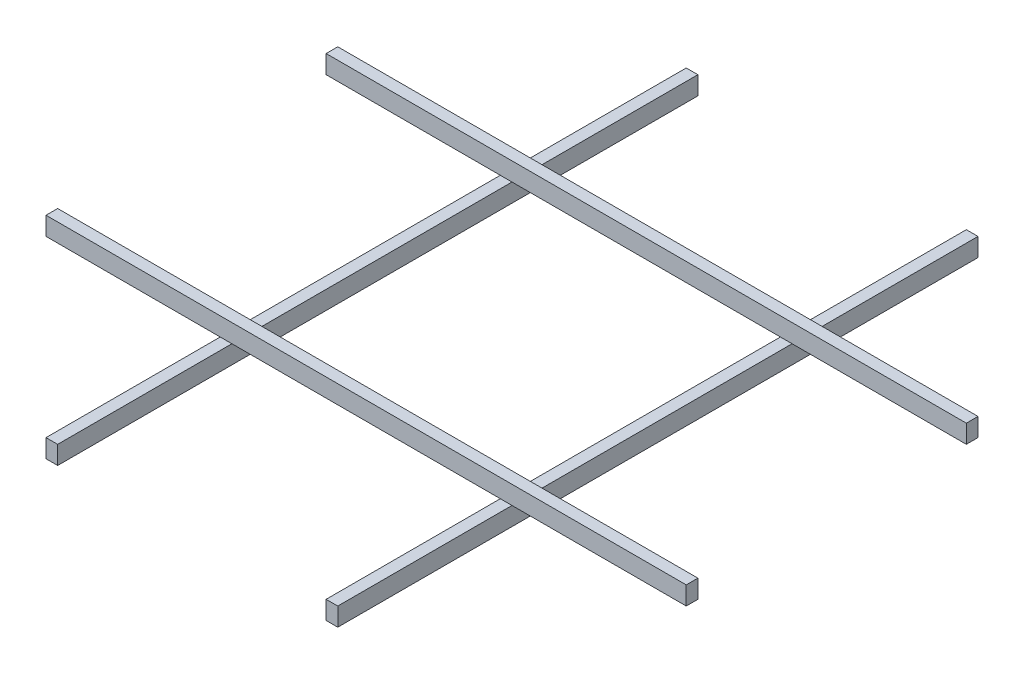
ISO-10303-21;
HEADER;
FILE_DESCRIPTION(('STEP AP214'),'2;1');
FILE_NAME('part.step','',(''),(''),'','','');
FILE_SCHEMA(('AUTOMOTIVE_DESIGN { 1 0 10303 214 1 1 1 1 }'));
ENDSEC;
DATA;
#1=APPLICATION_CONTEXT('core data for automotive mechanical design processes');
#2=APPLICATION_PROTOCOL_DEFINITION('international standard','automotive_design',2000,#1);
#3=PRODUCT_CONTEXT('',#1,'mechanical');
#4=PRODUCT('Part','Part','',(#3));
#5=PRODUCT_RELATED_PRODUCT_CATEGORY('part','',(#4));
#6=PRODUCT_DEFINITION_FORMATION('','',#4);
#7=PRODUCT_DEFINITION_CONTEXT('part definition',#1,'design');
#8=PRODUCT_DEFINITION('design','',#6,#7);
#9=PRODUCT_DEFINITION_SHAPE('','',#8);
#10=(LENGTH_UNIT() NAMED_UNIT(*) SI_UNIT(.MILLI.,.METRE.));
#11=(NAMED_UNIT(*) PLANE_ANGLE_UNIT() SI_UNIT($,.RADIAN.));
#12=(NAMED_UNIT(*) SI_UNIT($,.STERADIAN.) SOLID_ANGLE_UNIT());
#13=UNCERTAINTY_MEASURE_WITH_UNIT(LENGTH_MEASURE(1.E-05),#10,'distance_accuracy_value','');
#14=(GEOMETRIC_REPRESENTATION_CONTEXT(3) GLOBAL_UNCERTAINTY_ASSIGNED_CONTEXT((#13)) GLOBAL_UNIT_ASSIGNED_CONTEXT((#10,
#11,#12)) REPRESENTATION_CONTEXT('',''));
#15=CARTESIAN_POINT('',(0.,0.,0.));
#16=DIRECTION('',(0.,0.,1.));
#17=DIRECTION('',(1.,0.,0.));
#18=AXIS2_PLACEMENT_3D('',#15,#16,#17);
#19=CARTESIAN_POINT('',(4572.,209.55,-1416.05));
#20=DIRECTION('',(0.,0.,1.));
#21=DIRECTION('',(1.,0.,0.));
#22=AXIS2_PLACEMENT_3D('',#19,#20,#21);
#23=PLANE('',#22);
#24=DIRECTION('',(0.,1.,0.));
#25=VECTOR('',#24,1.);
#26=CARTESIAN_POINT('',(-304.8,209.55,-1416.05));
#27=LINE('',#26,#25);
#28=CARTESIAN_POINT('',(-304.8,69.85,-1416.05));
#29=VERTEX_POINT('',#28);
#30=CARTESIAN_POINT('',(-304.8,209.55,-1416.05));
#31=VERTEX_POINT('',#30);
#32=EDGE_CURVE('E134',#29,#31,#27,.T.);
#33=ORIENTED_EDGE('',*,*,#32,.T.);
#34=DIRECTION('',(-1.,0.,0.));
#35=VECTOR('',#34,1.);
#36=CARTESIAN_POINT('',(4572.,209.55,-1416.05));
#37=LINE('',#36,#35);
#38=CARTESIAN_POINT('',(4572.,209.55,-1416.05));
#39=VERTEX_POINT('',#38);
#40=EDGE_CURVE('E13',#39,#31,#37,.T.);
#41=ORIENTED_EDGE('',*,*,#40,.F.);
#42=DIRECTION('',(0.,1.,0.));
#43=VECTOR('',#42,1.);
#44=CARTESIAN_POINT('',(4572.,209.55,-1416.05));
#45=LINE('',#44,#43);
#46=CARTESIAN_POINT('',(4572.,69.85,-1416.05));
#47=VERTEX_POINT('',#46);
#48=EDGE_CURVE('E121',#47,#39,#45,.T.);
#49=ORIENTED_EDGE('',*,*,#48,.F.);
#50=DIRECTION('',(-1.,0.,0.));
#51=VECTOR('',#50,1.);
#52=CARTESIAN_POINT('',(4572.,69.85,-1416.05));
#53=LINE('',#52,#51);
#54=EDGE_CURVE('E130',#47,#29,#53,.T.);
#55=ORIENTED_EDGE('',*,*,#54,.T.);
#56=EDGE_LOOP('',(#33,#41,#49,#55));
#57=FACE_BOUND('',#56,.T.);
#58=ADVANCED_FACE('F69',(#57),#23,.F.);
#59=CARTESIAN_POINT('',(4572.,209.55,-1327.15));
#60=DIRECTION('',(0.,-1.,0.));
#61=DIRECTION('',(0.,0.,-1.));
#62=AXIS2_PLACEMENT_3D('',#59,#60,#61);
#63=PLANE('',#62);
#64=DIRECTION('',(0.,0.,1.));
#65=VECTOR('',#64,1.);
#66=CARTESIAN_POINT('',(-304.8,209.55,-1327.15));
#67=LINE('',#66,#65);
#68=CARTESIAN_POINT('',(-304.8,209.55,-1327.15));
#69=VERTEX_POINT('',#68);
#70=EDGE_CURVE('E125',#31,#69,#67,.T.);
#71=ORIENTED_EDGE('',*,*,#70,.T.);
#72=DIRECTION('',(-1.,0.,0.));
#73=VECTOR('',#72,1.);
#74=CARTESIAN_POINT('',(4572.,209.55,-1327.15));
#75=LINE('',#74,#73);
#76=CARTESIAN_POINT('',(4572.,209.55,-1327.15));
#77=VERTEX_POINT('',#76);
#78=EDGE_CURVE('E78',#77,#69,#75,.T.);
#79=ORIENTED_EDGE('',*,*,#78,.F.);
#80=DIRECTION('',(0.,0.,1.));
#81=VECTOR('',#80,1.);
#82=CARTESIAN_POINT('',(4572.,209.55,-1327.15));
#83=LINE('',#82,#81);
#84=EDGE_CURVE('E116',#39,#77,#83,.T.);
#85=ORIENTED_EDGE('',*,*,#84,.F.);
#86=ORIENTED_EDGE('',*,*,#40,.T.);
#87=EDGE_LOOP('',(#71,#79,#85,#86));
#88=FACE_BOUND('',#87,.T.);
#89=ADVANCED_FACE('F124',(#88),#63,.F.);
#90=CARTESIAN_POINT('',(4572.,209.55,-1327.15));
#91=DIRECTION('',(0.,0.,-1.));
#92=DIRECTION('',(-1.,0.,0.));
#93=AXIS2_PLACEMENT_3D('',#90,#91,#92);
#94=PLANE('',#93);
#95=DIRECTION('',(0.,-1.,0.));
#96=VECTOR('',#95,1.);
#97=CARTESIAN_POINT('',(-304.8,209.55,-1327.15));
#98=LINE('',#97,#96);
#99=CARTESIAN_POINT('',(-304.8,69.85,-1327.15));
#100=VERTEX_POINT('',#99);
#101=EDGE_CURVE('E103',#69,#100,#98,.T.);
#102=ORIENTED_EDGE('',*,*,#101,.T.);
#103=DIRECTION('',(-1.,0.,0.));
#104=VECTOR('',#103,1.);
#105=CARTESIAN_POINT('',(4572.,69.85,-1327.15));
#106=LINE('',#105,#104);
#107=CARTESIAN_POINT('',(4572.,69.85,-1327.15));
#108=VERTEX_POINT('',#107);
#109=EDGE_CURVE('E127',#108,#100,#106,.T.);
#110=ORIENTED_EDGE('',*,*,#109,.F.);
#111=DIRECTION('',(0.,-1.,0.));
#112=VECTOR('',#111,1.);
#113=CARTESIAN_POINT('',(4572.,209.55,-1327.15));
#114=LINE('',#113,#112);
#115=EDGE_CURVE('E119',#77,#108,#114,.T.);
#116=ORIENTED_EDGE('',*,*,#115,.F.);
#117=ORIENTED_EDGE('',*,*,#78,.T.);
#118=EDGE_LOOP('',(#102,#110,#116,#117));
#119=FACE_BOUND('',#118,.T.);
#120=ADVANCED_FACE('F128',(#119),#94,.F.);
#121=CARTESIAN_POINT('',(4572.,69.85,-1327.15));
#122=DIRECTION('',(0.,1.,0.));
#123=DIRECTION('',(0.,0.,1.));
#124=AXIS2_PLACEMENT_3D('',#121,#122,#123);
#125=PLANE('',#124);
#126=DIRECTION('',(0.,0.,-1.));
#127=VECTOR('',#126,1.);
#128=CARTESIAN_POINT('',(-304.8,69.85,-1327.15));
#129=LINE('',#128,#127);
#130=EDGE_CURVE('E109',#100,#29,#129,.T.);
#131=ORIENTED_EDGE('',*,*,#130,.T.);
#132=ORIENTED_EDGE('',*,*,#54,.F.);
#133=DIRECTION('',(0.,0.,-1.));
#134=VECTOR('',#133,1.);
#135=CARTESIAN_POINT('',(4572.,69.85,-1327.15));
#136=LINE('',#135,#134);
#137=EDGE_CURVE('E86',#108,#47,#136,.T.);
#138=ORIENTED_EDGE('',*,*,#137,.F.);
#139=ORIENTED_EDGE('',*,*,#109,.T.);
#140=EDGE_LOOP('',(#131,#132,#138,#139));
#141=FACE_BOUND('',#140,.T.);
#142=ADVANCED_FACE('F143',(#141),#125,.F.);
#143=CARTESIAN_POINT('',(4572.,139.7,-2438.4));
#144=DIRECTION('',(1.,0.,0.));
#145=DIRECTION('',(0.,0.,-1.));
#146=AXIS2_PLACEMENT_3D('',#143,#144,#145);
#147=PLANE('',#146);
#148=ORIENTED_EDGE('',*,*,#48,.T.);
#149=ORIENTED_EDGE('',*,*,#84,.T.);
#150=ORIENTED_EDGE('',*,*,#115,.T.);
#151=ORIENTED_EDGE('',*,*,#137,.T.);
#152=EDGE_LOOP('',(#148,#149,#150,#151));
#153=FACE_BOUND('',#152,.T.);
#154=ADVANCED_FACE('F117',(#153),#147,.T.);
#155=CARTESIAN_POINT('',(-304.8,139.7,-2438.4));
#156=DIRECTION('',(1.,0.,0.));
#157=DIRECTION('',(0.,0.,-1.));
#158=AXIS2_PLACEMENT_3D('',#155,#156,#157);
#159=PLANE('',#158);
#160=ORIENTED_EDGE('',*,*,#32,.F.);
#161=ORIENTED_EDGE('',*,*,#130,.F.);
#162=ORIENTED_EDGE('',*,*,#101,.F.);
#163=ORIENTED_EDGE('',*,*,#70,.F.);
#164=EDGE_LOOP('',(#160,#161,#162,#163));
#165=FACE_BOUND('',#164,.T.);
#166=ADVANCED_FACE('F146',(#165),#159,.F.);
#167=CLOSED_SHELL('',(#58,#89,#120,#142,#154,#166));
#168=MANIFOLD_SOLID_BREP('B2',#167);
#169=CARTESIAN_POINT('',(4572.,209.55,-3549.65));
#170=DIRECTION('',(0.,0.,1.));
#171=DIRECTION('',(1.,0.,0.));
#172=AXIS2_PLACEMENT_3D('',#169,#170,#171);
#173=PLANE('',#172);
#174=DIRECTION('',(0.,1.,0.));
#175=VECTOR('',#174,1.);
#176=CARTESIAN_POINT('',(-304.8,209.55,-3549.65));
#177=LINE('',#176,#175);
#178=CARTESIAN_POINT('',(-304.8,69.85,-3549.65));
#179=VERTEX_POINT('',#178);
#180=CARTESIAN_POINT('',(-304.8,209.55,-3549.65));
#181=VERTEX_POINT('',#180);
#182=EDGE_CURVE('E295',#179,#181,#177,.T.);
#183=ORIENTED_EDGE('',*,*,#182,.T.);
#184=DIRECTION('',(-1.,0.,0.));
#185=VECTOR('',#184,1.);
#186=CARTESIAN_POINT('',(4572.,209.55,-3549.65));
#187=LINE('',#186,#185);
#188=CARTESIAN_POINT('',(4572.,209.55,-3549.65));
#189=VERTEX_POINT('',#188);
#190=EDGE_CURVE('E67',#189,#181,#187,.T.);
#191=ORIENTED_EDGE('',*,*,#190,.F.);
#192=DIRECTION('',(0.,1.,0.));
#193=VECTOR('',#192,1.);
#194=CARTESIAN_POINT('',(4572.,209.55,-3549.65));
#195=LINE('',#194,#193);
#196=CARTESIAN_POINT('',(4572.,69.85,-3549.65));
#197=VERTEX_POINT('',#196);
#198=EDGE_CURVE('E282',#197,#189,#195,.T.);
#199=ORIENTED_EDGE('',*,*,#198,.F.);
#200=DIRECTION('',(-1.,0.,0.));
#201=VECTOR('',#200,1.);
#202=CARTESIAN_POINT('',(4572.,69.85,-3549.65));
#203=LINE('',#202,#201);
#204=EDGE_CURVE('E291',#197,#179,#203,.T.);
#205=ORIENTED_EDGE('',*,*,#204,.T.);
#206=EDGE_LOOP('',(#183,#191,#199,#205));
#207=FACE_BOUND('',#206,.T.);
#208=ADVANCED_FACE('F230',(#207),#173,.F.);
#209=CARTESIAN_POINT('',(4572.,209.55,-3460.75));
#210=DIRECTION('',(0.,-1.,0.));
#211=DIRECTION('',(0.,0.,-1.));
#212=AXIS2_PLACEMENT_3D('',#209,#210,#211);
#213=PLANE('',#212);
#214=DIRECTION('',(0.,0.,1.));
#215=VECTOR('',#214,1.);
#216=CARTESIAN_POINT('',(-304.8,209.55,-3460.75));
#217=LINE('',#216,#215);
#218=CARTESIAN_POINT('',(-304.8,209.55,-3460.75));
#219=VERTEX_POINT('',#218);
#220=EDGE_CURVE('E286',#181,#219,#217,.T.);
#221=ORIENTED_EDGE('',*,*,#220,.T.);
#222=DIRECTION('',(-1.,0.,0.));
#223=VECTOR('',#222,1.);
#224=CARTESIAN_POINT('',(4572.,209.55,-3460.75));
#225=LINE('',#224,#223);
#226=CARTESIAN_POINT('',(4572.,209.55,-3460.75));
#227=VERTEX_POINT('',#226);
#228=EDGE_CURVE('E239',#227,#219,#225,.T.);
#229=ORIENTED_EDGE('',*,*,#228,.F.);
#230=DIRECTION('',(0.,0.,1.));
#231=VECTOR('',#230,1.);
#232=CARTESIAN_POINT('',(4572.,209.55,-3460.75));
#233=LINE('',#232,#231);
#234=EDGE_CURVE('E277',#189,#227,#233,.T.);
#235=ORIENTED_EDGE('',*,*,#234,.F.);
#236=ORIENTED_EDGE('',*,*,#190,.T.);
#237=EDGE_LOOP('',(#221,#229,#235,#236));
#238=FACE_BOUND('',#237,.T.);
#239=ADVANCED_FACE('F285',(#238),#213,.F.);
#240=CARTESIAN_POINT('',(4572.,209.55,-3460.75));
#241=DIRECTION('',(0.,0.,-1.));
#242=DIRECTION('',(-1.,0.,0.));
#243=AXIS2_PLACEMENT_3D('',#240,#241,#242);
#244=PLANE('',#243);
#245=DIRECTION('',(0.,-1.,0.));
#246=VECTOR('',#245,1.);
#247=CARTESIAN_POINT('',(-304.8,209.55,-3460.75));
#248=LINE('',#247,#246);
#249=CARTESIAN_POINT('',(-304.8,69.85,-3460.75));
#250=VERTEX_POINT('',#249);
#251=EDGE_CURVE('E264',#219,#250,#248,.T.);
#252=ORIENTED_EDGE('',*,*,#251,.T.);
#253=DIRECTION('',(-1.,0.,0.));
#254=VECTOR('',#253,1.);
#255=CARTESIAN_POINT('',(4572.,69.85,-3460.75));
#256=LINE('',#255,#254);
#257=CARTESIAN_POINT('',(4572.,69.85,-3460.75));
#258=VERTEX_POINT('',#257);
#259=EDGE_CURVE('E288',#258,#250,#256,.T.);
#260=ORIENTED_EDGE('',*,*,#259,.F.);
#261=DIRECTION('',(0.,-1.,0.));
#262=VECTOR('',#261,1.);
#263=CARTESIAN_POINT('',(4572.,209.55,-3460.75));
#264=LINE('',#263,#262);
#265=EDGE_CURVE('E280',#227,#258,#264,.T.);
#266=ORIENTED_EDGE('',*,*,#265,.F.);
#267=ORIENTED_EDGE('',*,*,#228,.T.);
#268=EDGE_LOOP('',(#252,#260,#266,#267));
#269=FACE_BOUND('',#268,.T.);
#270=ADVANCED_FACE('F289',(#269),#244,.F.);
#271=CARTESIAN_POINT('',(4572.,69.85,-3460.75));
#272=DIRECTION('',(0.,1.,0.));
#273=DIRECTION('',(0.,0.,1.));
#274=AXIS2_PLACEMENT_3D('',#271,#272,#273);
#275=PLANE('',#274);
#276=DIRECTION('',(0.,0.,-1.));
#277=VECTOR('',#276,1.);
#278=CARTESIAN_POINT('',(-304.8,69.85,-3460.75));
#279=LINE('',#278,#277);
#280=EDGE_CURVE('E270',#250,#179,#279,.T.);
#281=ORIENTED_EDGE('',*,*,#280,.T.);
#282=ORIENTED_EDGE('',*,*,#204,.F.);
#283=DIRECTION('',(0.,0.,-1.));
#284=VECTOR('',#283,1.);
#285=CARTESIAN_POINT('',(4572.,69.85,-3460.75));
#286=LINE('',#285,#284);
#287=EDGE_CURVE('E247',#258,#197,#286,.T.);
#288=ORIENTED_EDGE('',*,*,#287,.F.);
#289=ORIENTED_EDGE('',*,*,#259,.T.);
#290=EDGE_LOOP('',(#281,#282,#288,#289));
#291=FACE_BOUND('',#290,.T.);
#292=ADVANCED_FACE('F304',(#291),#275,.F.);
#293=CARTESIAN_POINT('',(4572.,139.7,-4572.));
#294=DIRECTION('',(1.,0.,0.));
#295=DIRECTION('',(0.,0.,-1.));
#296=AXIS2_PLACEMENT_3D('',#293,#294,#295);
#297=PLANE('',#296);
#298=ORIENTED_EDGE('',*,*,#198,.T.);
#299=ORIENTED_EDGE('',*,*,#234,.T.);
#300=ORIENTED_EDGE('',*,*,#265,.T.);
#301=ORIENTED_EDGE('',*,*,#287,.T.);
#302=EDGE_LOOP('',(#298,#299,#300,#301));
#303=FACE_BOUND('',#302,.T.);
#304=ADVANCED_FACE('F278',(#303),#297,.T.);
#305=CARTESIAN_POINT('',(-304.8,139.7,-4572.));
#306=DIRECTION('',(1.,0.,0.));
#307=DIRECTION('',(0.,0.,-1.));
#308=AXIS2_PLACEMENT_3D('',#305,#306,#307);
#309=PLANE('',#308);
#310=ORIENTED_EDGE('',*,*,#182,.F.);
#311=ORIENTED_EDGE('',*,*,#280,.F.);
#312=ORIENTED_EDGE('',*,*,#251,.F.);
#313=ORIENTED_EDGE('',*,*,#220,.F.);
#314=EDGE_LOOP('',(#310,#311,#312,#313));
#315=FACE_BOUND('',#314,.T.);
#316=ADVANCED_FACE('F307',(#315),#309,.F.);
#317=CLOSED_SHELL('',(#208,#239,#270,#292,#304,#316));
#318=MANIFOLD_SOLID_BREP('B7',#317);
#319=CARTESIAN_POINT('',(3155.95,69.85,-4876.8));
#320=DIRECTION('',(1.,0.,0.));
#321=DIRECTION('',(0.,0.,-1.));
#322=AXIS2_PLACEMENT_3D('',#319,#320,#321);
#323=PLANE('',#322);
#324=DIRECTION('',(0.,1.,0.));
#325=VECTOR('',#324,1.);
#326=CARTESIAN_POINT('',(3155.95,69.85,1.95967980799559E-13));
#327=LINE('',#326,#325);
#328=CARTESIAN_POINT('',(3155.95,-69.85,1.95967980799559E-13));
#329=VERTEX_POINT('',#328);
#330=CARTESIAN_POINT('',(3155.95,69.85,1.95967980799559E-13));
#331=VERTEX_POINT('',#330);
#332=EDGE_CURVE('E455',#329,#331,#327,.T.);
#333=ORIENTED_EDGE('',*,*,#332,.T.);
#334=DIRECTION('',(0.,0.,1.));
#335=VECTOR('',#334,1.);
#336=CARTESIAN_POINT('',(3155.95,69.85,-4876.8));
#337=LINE('',#336,#335);
#338=CARTESIAN_POINT('',(3155.95,69.85,-4876.8));
#339=VERTEX_POINT('',#338);
#340=EDGE_CURVE('E228',#339,#331,#337,.T.);
#341=ORIENTED_EDGE('',*,*,#340,.F.);
#342=DIRECTION('',(0.,1.,0.));
#343=VECTOR('',#342,1.);
#344=CARTESIAN_POINT('',(3155.95,69.85,-4876.8));
#345=LINE('',#344,#343);
#346=CARTESIAN_POINT('',(3155.95,-69.85,-4876.8));
#347=VERTEX_POINT('',#346);
#348=EDGE_CURVE('E443',#347,#339,#345,.T.);
#349=ORIENTED_EDGE('',*,*,#348,.F.);
#350=DIRECTION('',(0.,0.,1.));
#351=VECTOR('',#350,1.);
#352=CARTESIAN_POINT('',(3155.95,-69.85,-4876.8));
#353=LINE('',#352,#351);
#354=EDGE_CURVE('E451',#347,#329,#353,.T.);
#355=ORIENTED_EDGE('',*,*,#354,.T.);
#356=EDGE_LOOP('',(#333,#341,#349,#355));
#357=FACE_BOUND('',#356,.T.);
#358=ADVANCED_FACE('F392',(#357),#323,.F.);
#359=CARTESIAN_POINT('',(3244.85,69.85,-4876.8));
#360=DIRECTION('',(0.,-1.,0.));
#361=DIRECTION('',(0.,0.,-1.));
#362=AXIS2_PLACEMENT_3D('',#359,#360,#361);
#363=PLANE('',#362);
#364=DIRECTION('',(1.,0.,0.));
#365=VECTOR('',#364,1.);
#366=CARTESIAN_POINT('',(3244.85,69.85,1.95967980799559E-13));
#367=LINE('',#366,#365);
#368=CARTESIAN_POINT('',(3244.85,69.85,1.95967980799559E-13));
#369=VERTEX_POINT('',#368);
#370=EDGE_CURVE('E447',#331,#369,#367,.T.);
#371=ORIENTED_EDGE('',*,*,#370,.T.);
#372=DIRECTION('',(0.,0.,1.));
#373=VECTOR('',#372,1.);
#374=CARTESIAN_POINT('',(3244.85,69.85,-4876.8));
#375=LINE('',#374,#373);
#376=CARTESIAN_POINT('',(3244.85,69.85,-4876.8));
#377=VERTEX_POINT('',#376);
#378=EDGE_CURVE('E400',#377,#369,#375,.T.);
#379=ORIENTED_EDGE('',*,*,#378,.F.);
#380=DIRECTION('',(1.,0.,0.));
#381=VECTOR('',#380,1.);
#382=CARTESIAN_POINT('',(3244.85,69.85,-4876.8));
#383=LINE('',#382,#381);
#384=EDGE_CURVE('E438',#339,#377,#383,.T.);
#385=ORIENTED_EDGE('',*,*,#384,.F.);
#386=ORIENTED_EDGE('',*,*,#340,.T.);
#387=EDGE_LOOP('',(#371,#379,#385,#386));
#388=FACE_BOUND('',#387,.T.);
#389=ADVANCED_FACE('F446',(#388),#363,.F.);
#390=CARTESIAN_POINT('',(3244.85,69.85,-4876.8));
#391=DIRECTION('',(-1.,0.,0.));
#392=DIRECTION('',(0.,0.,1.));
#393=AXIS2_PLACEMENT_3D('',#390,#391,#392);
#394=PLANE('',#393);
#395=DIRECTION('',(0.,-1.,0.));
#396=VECTOR('',#395,1.);
#397=CARTESIAN_POINT('',(3244.85,69.85,1.95967980799559E-13));
#398=LINE('',#397,#396);
#399=CARTESIAN_POINT('',(3244.85,-69.85,1.95967980799559E-13));
#400=VERTEX_POINT('',#399);
#401=EDGE_CURVE('E425',#369,#400,#398,.T.);
#402=ORIENTED_EDGE('',*,*,#401,.T.);
#403=DIRECTION('',(0.,0.,1.));
#404=VECTOR('',#403,1.);
#405=CARTESIAN_POINT('',(3244.85,-69.85,-4876.8));
#406=LINE('',#405,#404);
#407=CARTESIAN_POINT('',(3244.85,-69.85,-4876.8));
#408=VERTEX_POINT('',#407);
#409=EDGE_CURVE('E448',#408,#400,#406,.T.);
#410=ORIENTED_EDGE('',*,*,#409,.F.);
#411=DIRECTION('',(0.,-1.,0.));
#412=VECTOR('',#411,1.);
#413=CARTESIAN_POINT('',(3244.85,69.85,-4876.8));
#414=LINE('',#413,#412);
#415=EDGE_CURVE('E441',#377,#408,#414,.T.);
#416=ORIENTED_EDGE('',*,*,#415,.F.);
#417=ORIENTED_EDGE('',*,*,#378,.T.);
#418=EDGE_LOOP('',(#402,#410,#416,#417));
#419=FACE_BOUND('',#418,.T.);
#420=ADVANCED_FACE('F449',(#419),#394,.F.);
#421=CARTESIAN_POINT('',(3244.85,-69.85,-4876.8));
#422=DIRECTION('',(0.,1.,0.));
#423=DIRECTION('',(0.,0.,1.));
#424=AXIS2_PLACEMENT_3D('',#421,#422,#423);
#425=PLANE('',#424);
#426=DIRECTION('',(-1.,0.,0.));
#427=VECTOR('',#426,1.);
#428=CARTESIAN_POINT('',(3244.85,-69.85,1.95967980799559E-13));
#429=LINE('',#428,#427);
#430=EDGE_CURVE('E431',#400,#329,#429,.T.);
#431=ORIENTED_EDGE('',*,*,#430,.T.);
#432=ORIENTED_EDGE('',*,*,#354,.F.);
#433=DIRECTION('',(-1.,0.,0.));
#434=VECTOR('',#433,1.);
#435=CARTESIAN_POINT('',(3244.85,-69.85,-4876.8));
#436=LINE('',#435,#434);
#437=EDGE_CURVE('E408',#408,#347,#436,.T.);
#438=ORIENTED_EDGE('',*,*,#437,.F.);
#439=ORIENTED_EDGE('',*,*,#409,.T.);
#440=EDGE_LOOP('',(#431,#432,#438,#439));
#441=FACE_BOUND('',#440,.T.);
#442=ADVANCED_FACE('F462',(#441),#425,.F.);
#443=CARTESIAN_POINT('',(2133.6,0.,-4876.8));
#444=DIRECTION('',(0.,0.,-1.));
#445=DIRECTION('',(-1.,0.,0.));
#446=AXIS2_PLACEMENT_3D('',#443,#444,#445);
#447=PLANE('',#446);
#448=ORIENTED_EDGE('',*,*,#348,.T.);
#449=ORIENTED_EDGE('',*,*,#384,.T.);
#450=ORIENTED_EDGE('',*,*,#415,.T.);
#451=ORIENTED_EDGE('',*,*,#437,.T.);
#452=EDGE_LOOP('',(#448,#449,#450,#451));
#453=FACE_BOUND('',#452,.T.);
#454=ADVANCED_FACE('F439',(#453),#447,.T.);
#455=CARTESIAN_POINT('',(2133.6,0.,1.95967980799559E-13));
#456=DIRECTION('',(0.,0.,-1.));
#457=DIRECTION('',(-1.,0.,0.));
#458=AXIS2_PLACEMENT_3D('',#455,#456,#457);
#459=PLANE('',#458);
#460=ORIENTED_EDGE('',*,*,#332,.F.);
#461=ORIENTED_EDGE('',*,*,#430,.F.);
#462=ORIENTED_EDGE('',*,*,#401,.F.);
#463=ORIENTED_EDGE('',*,*,#370,.F.);
#464=EDGE_LOOP('',(#460,#461,#462,#463));
#465=FACE_BOUND('',#464,.T.);
#466=ADVANCED_FACE('F465',(#465),#459,.F.);
#467=CLOSED_SHELL('',(#358,#389,#420,#442,#454,#466));
#468=MANIFOLD_SOLID_BREP('B61',#467);
#469=CARTESIAN_POINT('',(1022.35,69.85,-4876.8));
#470=DIRECTION('',(1.,0.,0.));
#471=DIRECTION('',(0.,0.,-1.));
#472=AXIS2_PLACEMENT_3D('',#469,#470,#471);
#473=PLANE('',#472);
#474=DIRECTION('',(0.,1.,0.));
#475=VECTOR('',#474,1.);
#476=CARTESIAN_POINT('',(1022.35,69.85,8.88178419700125E-13));
#477=LINE('',#476,#475);
#478=CARTESIAN_POINT('',(1022.35,-69.85,8.88178419700125E-13));
#479=VERTEX_POINT('',#478);
#480=CARTESIAN_POINT('',(1022.35,69.85,8.88178419700125E-13));
#481=VERTEX_POINT('',#480);
#482=EDGE_CURVE('E609',#479,#481,#477,.T.);
#483=ORIENTED_EDGE('',*,*,#482,.T.);
#484=DIRECTION('',(0.,0.,1.));
#485=VECTOR('',#484,1.);
#486=CARTESIAN_POINT('',(1022.35,69.85,-4876.8));
#487=LINE('',#486,#485);
#488=CARTESIAN_POINT('',(1022.35,69.85,-4876.8));
#489=VERTEX_POINT('',#488);
#490=EDGE_CURVE('E390',#489,#481,#487,.T.);
#491=ORIENTED_EDGE('',*,*,#490,.F.);
#492=DIRECTION('',(0.,1.,0.));
#493=VECTOR('',#492,1.);
#494=CARTESIAN_POINT('',(1022.35,69.85,-4876.8));
#495=LINE('',#494,#493);
#496=CARTESIAN_POINT('',(1022.35,-69.85,-4876.8));
#497=VERTEX_POINT('',#496);
#498=EDGE_CURVE('E593',#497,#489,#495,.T.);
#499=ORIENTED_EDGE('',*,*,#498,.F.);
#500=DIRECTION('',(0.,0.,1.));
#501=VECTOR('',#500,1.);
#502=CARTESIAN_POINT('',(1022.35,-69.85,-4876.8));
#503=LINE('',#502,#501);
#504=EDGE_CURVE('E605',#497,#479,#503,.T.);
#505=ORIENTED_EDGE('',*,*,#504,.T.);
#506=EDGE_LOOP('',(#483,#491,#499,#505));
#507=FACE_BOUND('',#506,.T.);
#508=ADVANCED_FACE('F539',(#507),#473,.F.);
#509=CARTESIAN_POINT('',(1111.25,69.85,-4876.8));
#510=DIRECTION('',(0.,-1.,0.));
#511=DIRECTION('',(0.,0.,-1.));
#512=AXIS2_PLACEMENT_3D('',#509,#510,#511);
#513=PLANE('',#512);
#514=DIRECTION('',(1.,0.,0.));
#515=VECTOR('',#514,1.);
#516=CARTESIAN_POINT('',(1111.25,69.85,8.88178419700125E-13));
#517=LINE('',#516,#515);
#518=CARTESIAN_POINT('',(1111.25,69.85,8.88178419700125E-13));
#519=VERTEX_POINT('',#518);
#520=EDGE_CURVE('E598',#481,#519,#517,.T.);
#521=ORIENTED_EDGE('',*,*,#520,.T.);
#522=DIRECTION('',(0.,0.,1.));
#523=VECTOR('',#522,1.);
#524=CARTESIAN_POINT('',(1111.25,69.85,-4876.8));
#525=LINE('',#524,#523);
#526=CARTESIAN_POINT('',(1111.25,69.85,-4876.8));
#527=VERTEX_POINT('',#526);
#528=EDGE_CURVE('E548',#527,#519,#525,.T.);
#529=ORIENTED_EDGE('',*,*,#528,.F.);
#530=DIRECTION('',(1.,0.,0.));
#531=VECTOR('',#530,1.);
#532=CARTESIAN_POINT('',(1111.25,69.85,-4876.8));
#533=LINE('',#532,#531);
#534=EDGE_CURVE('E588',#489,#527,#533,.T.);
#535=ORIENTED_EDGE('',*,*,#534,.F.);
#536=ORIENTED_EDGE('',*,*,#490,.T.);
#537=EDGE_LOOP('',(#521,#529,#535,#536));
#538=FACE_BOUND('',#537,.T.);
#539=ADVANCED_FACE('F597',(#538),#513,.F.);
#540=CARTESIAN_POINT('',(1111.25,69.85,-4876.8));
#541=DIRECTION('',(-1.,0.,0.));
#542=DIRECTION('',(0.,0.,1.));
#543=AXIS2_PLACEMENT_3D('',#540,#541,#542);
#544=PLANE('',#543);
#545=DIRECTION('',(0.,-1.,0.));
#546=VECTOR('',#545,1.);
#547=CARTESIAN_POINT('',(1111.25,69.85,8.88178419700125E-13));
#548=LINE('',#547,#546);
#549=CARTESIAN_POINT('',(1111.25,-69.85,8.88178419700125E-13));
#550=VERTEX_POINT('',#549);
#551=EDGE_CURVE('E573',#519,#550,#548,.T.);
#552=ORIENTED_EDGE('',*,*,#551,.T.);
#553=DIRECTION('',(0.,0.,1.));
#554=VECTOR('',#553,1.);
#555=CARTESIAN_POINT('',(1111.25,-69.85,-4876.8));
#556=LINE('',#555,#554);
#557=CARTESIAN_POINT('',(1111.25,-69.85,-4876.8));
#558=VERTEX_POINT('',#557);
#559=EDGE_CURVE('E600',#558,#550,#556,.T.);
#560=ORIENTED_EDGE('',*,*,#559,.F.);
#561=DIRECTION('',(0.,-1.,0.));
#562=VECTOR('',#561,1.);
#563=CARTESIAN_POINT('',(1111.25,69.85,-4876.8));
#564=LINE('',#563,#562);
#565=EDGE_CURVE('E591',#527,#558,#564,.T.);
#566=ORIENTED_EDGE('',*,*,#565,.F.);
#567=ORIENTED_EDGE('',*,*,#528,.T.);
#568=EDGE_LOOP('',(#552,#560,#566,#567));
#569=FACE_BOUND('',#568,.T.);
#570=ADVANCED_FACE('F601',(#569),#544,.F.);
#571=CARTESIAN_POINT('',(1111.25,-69.85,-4876.8));
#572=DIRECTION('',(0.,1.,0.));
#573=DIRECTION('',(0.,0.,1.));
#574=AXIS2_PLACEMENT_3D('',#571,#572,#573);
#575=PLANE('',#574);
#576=DIRECTION('',(-1.,0.,0.));
#577=VECTOR('',#576,1.);
#578=CARTESIAN_POINT('',(1111.25,-69.85,8.88178419700125E-13));
#579=LINE('',#578,#577);
#580=EDGE_CURVE('E579',#550,#479,#579,.T.);
#581=ORIENTED_EDGE('',*,*,#580,.T.);
#582=ORIENTED_EDGE('',*,*,#504,.F.);
#583=DIRECTION('',(-1.,0.,0.));
#584=VECTOR('',#583,1.);
#585=CARTESIAN_POINT('',(1111.25,-69.85,-4876.8));
#586=LINE('',#585,#584);
#587=EDGE_CURVE('E556',#558,#497,#586,.T.);
#588=ORIENTED_EDGE('',*,*,#587,.F.);
#589=ORIENTED_EDGE('',*,*,#559,.T.);
#590=EDGE_LOOP('',(#581,#582,#588,#589));
#591=FACE_BOUND('',#590,.T.);
#592=ADVANCED_FACE('F618',(#591),#575,.F.);
#593=CARTESIAN_POINT('',(0.,0.,-4876.8));
#594=DIRECTION('',(0.,0.,-1.));
#595=DIRECTION('',(-1.,0.,0.));
#596=AXIS2_PLACEMENT_3D('',#593,#594,#595);
#597=PLANE('',#596);
#598=ORIENTED_EDGE('',*,*,#498,.T.);
#599=ORIENTED_EDGE('',*,*,#534,.T.);
#600=ORIENTED_EDGE('',*,*,#565,.T.);
#601=ORIENTED_EDGE('',*,*,#587,.T.);
#602=EDGE_LOOP('',(#598,#599,#600,#601));
#603=FACE_BOUND('',#602,.T.);
#604=ADVANCED_FACE('F589',(#603),#597,.T.);
#605=CARTESIAN_POINT('',(0.,0.,8.88178419700125E-13));
#606=DIRECTION('',(0.,0.,-1.));
#607=DIRECTION('',(-1.,0.,0.));
#608=AXIS2_PLACEMENT_3D('',#605,#606,#607);
#609=PLANE('',#608);
#610=ORIENTED_EDGE('',*,*,#482,.F.);
#611=ORIENTED_EDGE('',*,*,#580,.F.);
#612=ORIENTED_EDGE('',*,*,#551,.F.);
#613=ORIENTED_EDGE('',*,*,#520,.F.);
#614=EDGE_LOOP('',(#610,#611,#612,#613));
#615=FACE_BOUND('',#614,.T.);
#616=ADVANCED_FACE('F621',(#615),#609,.F.);
#617=CLOSED_SHELL('',(#508,#539,#570,#592,#604,#616));
#618=MANIFOLD_SOLID_BREP('B222',#617);
#619=ADVANCED_BREP_SHAPE_REPRESENTATION('',(#18,#168,#318,#468,#618),#14);
#620=SHAPE_DEFINITION_REPRESENTATION(#9,#619);
ENDSEC;
END-ISO-10303-21;
